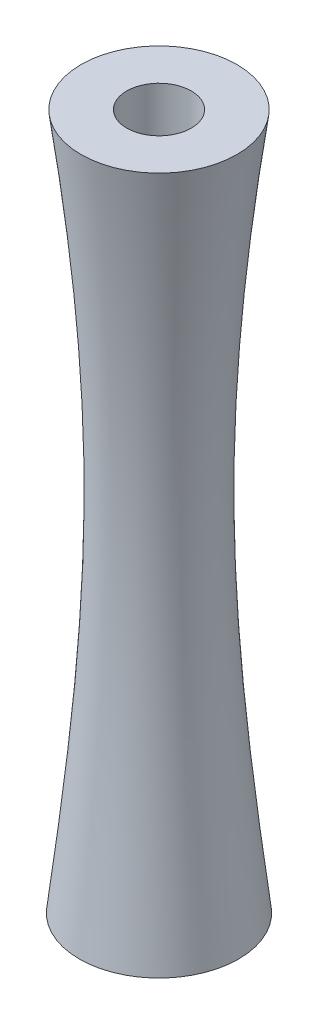
ISO-10303-21;
HEADER;
FILE_DESCRIPTION(('STEP AP214'),'2;1');
FILE_NAME('part.step','',(''),(''),'','','');
FILE_SCHEMA(('AUTOMOTIVE_DESIGN { 1 0 10303 214 1 1 1 1 }'));
ENDSEC;
DATA;
#1=APPLICATION_CONTEXT('core data for automotive mechanical design processes');
#2=APPLICATION_PROTOCOL_DEFINITION('international standard','automotive_design',2000,#1);
#3=PRODUCT_CONTEXT('',#1,'mechanical');
#4=PRODUCT('Part','Part','',(#3));
#5=PRODUCT_RELATED_PRODUCT_CATEGORY('part','',(#4));
#6=PRODUCT_DEFINITION_FORMATION('','',#4);
#7=PRODUCT_DEFINITION_CONTEXT('part definition',#1,'design');
#8=PRODUCT_DEFINITION('design','',#6,#7);
#9=PRODUCT_DEFINITION_SHAPE('','',#8);
#10=(LENGTH_UNIT() NAMED_UNIT(*) SI_UNIT(.MILLI.,.METRE.));
#11=(NAMED_UNIT(*) PLANE_ANGLE_UNIT() SI_UNIT($,.RADIAN.));
#12=(NAMED_UNIT(*) SI_UNIT($,.STERADIAN.) SOLID_ANGLE_UNIT());
#13=UNCERTAINTY_MEASURE_WITH_UNIT(LENGTH_MEASURE(1.E-05),#10,'distance_accuracy_value','');
#14=(GEOMETRIC_REPRESENTATION_CONTEXT(3) GLOBAL_UNCERTAINTY_ASSIGNED_CONTEXT((#13)) GLOBAL_UNIT_ASSIGNED_CONTEXT((#10,
#11,#12)) REPRESENTATION_CONTEXT('',''));
#15=CARTESIAN_POINT('',(0.,0.,0.));
#16=DIRECTION('',(0.,0.,1.));
#17=DIRECTION('',(1.,0.,0.));
#18=AXIS2_PLACEMENT_3D('',#15,#16,#17);
#19=CARTESIAN_POINT('',(0.,31.8912158031988,0.));
#20=DIRECTION('',(0.,-1.,0.));
#21=DIRECTION('',(1.,0.,0.));
#22=AXIS2_PLACEMENT_3D('',#19,#20,#21);
#23=PLANE('',#22);
#24=CARTESIAN_POINT('',(0.,31.8912158031988,0.));
#25=DIRECTION('',(0.,1.,0.));
#26=DIRECTION('',(-1.,0.,0.));
#27=AXIS2_PLACEMENT_3D('',#24,#25,#26);
#28=CIRCLE('',#27,2.999994);
#29=CARTESIAN_POINT('',(-2.999994,31.8912158031988,0.));
#30=VERTEX_POINT('',#29);
#31=EDGE_CURVE('E59',#30,#30,#28,.T.);
#32=ORIENTED_EDGE('',*,*,#31,.F.);
#33=EDGE_LOOP('',(#32));
#34=FACE_BOUND('',#33,.T.);
#35=CARTESIAN_POINT('',(0.,31.8912158031988,0.));
#36=DIRECTION('',(0.,1.,0.));
#37=DIRECTION('',(-1.,0.,0.));
#38=AXIS2_PLACEMENT_3D('',#35,#36,#37);
#39=CIRCLE('',#38,7.25214208838339);
#40=CARTESIAN_POINT('',(-7.25214208838339,31.8912158031988,0.));
#41=VERTEX_POINT('',#40);
#42=EDGE_CURVE('E10',#41,#41,#39,.T.);
#43=ORIENTED_EDGE('',*,*,#42,.T.);
#44=EDGE_LOOP('',(#43));
#45=FACE_BOUND('',#44,.T.);
#46=ADVANCED_FACE('F42',(#34,#45),#23,.F.);
#47=CARTESIAN_POINT('',(-7.25214208838339,31.8912158031988,0.));
#48=CARTESIAN_POINT('',(-3.66042974283976,6.11814421316097,0.));
#49=CARTESIAN_POINT('',(-4.66042962688091,-9.91465810819148,0.));
#50=CARTESIAN_POINT('',(-7.40952314000003,-32.8467452642078,0.));
#51=B_SPLINE_CURVE_WITH_KNOTS('',3,(#47,#48,#49,#50),.UNSPECIFIED.,.F.,.F.,(4,4),(0.,1.),.UNSPECIFIED.);
#52=CARTESIAN_POINT('',(0.,31.8912158031988,0.));
#53=DIRECTION('',(0.,1.,0.));
#54=AXIS1_PLACEMENT('',#52,#53);
#55=SURFACE_OF_REVOLUTION('',#51,#54);
#56=CARTESIAN_POINT('',(0.,-32.8467452642077,0.));
#57=DIRECTION('',(0.,1.,0.));
#58=DIRECTION('',(-1.,0.,0.));
#59=AXIS2_PLACEMENT_3D('',#56,#57,#58);
#60=CIRCLE('',#59,7.40952314000004);
#61=CARTESIAN_POINT('',(-7.40952314000003,-32.8467452642077,0.));
#62=VERTEX_POINT('',#61);
#63=EDGE_CURVE('E49',#62,#62,#60,.T.);
#64=ORIENTED_EDGE('',*,*,#63,.T.);
#65=EDGE_LOOP('',(#64));
#66=FACE_BOUND('',#65,.T.);
#67=ORIENTED_EDGE('',*,*,#42,.F.);
#68=EDGE_LOOP('',(#67));
#69=FACE_BOUND('',#68,.T.);
#70=ADVANCED_FACE('F69',(#66,#69),#55,.F.);
#71=CARTESIAN_POINT('',(0.,-32.8467452642077,0.));
#72=DIRECTION('',(0.,1.,0.));
#73=DIRECTION('',(-1.,0.,0.));
#74=AXIS2_PLACEMENT_3D('',#71,#72,#73);
#75=PLANE('',#74);
#76=CARTESIAN_POINT('',(0.,-32.8467452642078,0.));
#77=DIRECTION('',(0.,1.,0.));
#78=DIRECTION('',(-1.,0.,0.));
#79=AXIS2_PLACEMENT_3D('',#76,#77,#78);
#80=CIRCLE('',#79,2.999994);
#81=CARTESIAN_POINT('',(-2.999994,-32.8467452642078,0.));
#82=VERTEX_POINT('',#81);
#83=EDGE_CURVE('E54',#82,#82,#80,.T.);
#84=ORIENTED_EDGE('',*,*,#83,.T.);
#85=EDGE_LOOP('',(#84));
#86=FACE_BOUND('',#85,.T.);
#87=ORIENTED_EDGE('',*,*,#63,.F.);
#88=EDGE_LOOP('',(#87));
#89=FACE_BOUND('',#88,.T.);
#90=ADVANCED_FACE('F72',(#86,#89),#75,.F.);
#91=CARTESIAN_POINT('',(0.,-32.8467452642078,0.));
#92=DIRECTION('',(0.,1.,0.));
#93=DIRECTION('',(-1.,0.,0.));
#94=AXIS2_PLACEMENT_3D('',#91,#92,#93);
#95=CYLINDRICAL_SURFACE('',#94,2.999994);
#96=ORIENTED_EDGE('',*,*,#83,.F.);
#97=EDGE_LOOP('',(#96));
#98=FACE_BOUND('',#97,.T.);
#99=ORIENTED_EDGE('',*,*,#31,.T.);
#100=EDGE_LOOP('',(#99));
#101=FACE_BOUND('',#100,.T.);
#102=ADVANCED_FACE('F75',(#98,#101),#95,.F.);
#103=CLOSED_SHELL('',(#46,#70,#90,#102));
#104=MANIFOLD_SOLID_BREP('B2',#103);
#105=ADVANCED_BREP_SHAPE_REPRESENTATION('',(#18,#104),#14);
#106=SHAPE_DEFINITION_REPRESENTATION(#9,#105);
ENDSEC;
END-ISO-10303-21;
